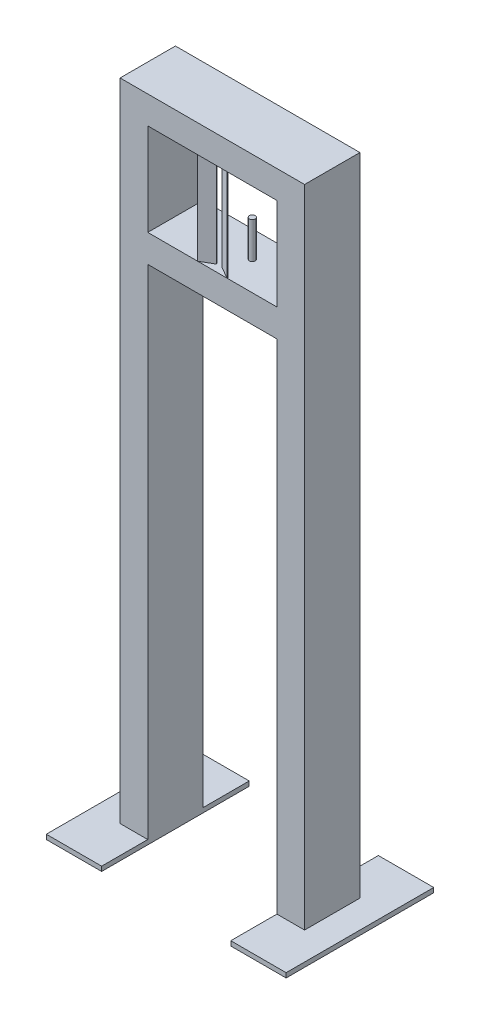
ISO-10303-21;
HEADER;
FILE_DESCRIPTION(('STEP AP214'),'2;1');
FILE_NAME('part.step','',(''),(''),'','','');
FILE_SCHEMA(('AUTOMOTIVE_DESIGN { 1 0 10303 214 1 1 1 1 }'));
ENDSEC;
DATA;
#1=APPLICATION_CONTEXT('core data for automotive mechanical design processes');
#2=APPLICATION_PROTOCOL_DEFINITION('international standard','automotive_design',2000,#1);
#3=PRODUCT_CONTEXT('',#1,'mechanical');
#4=PRODUCT('Part','Part','',(#3));
#5=PRODUCT_RELATED_PRODUCT_CATEGORY('part','',(#4));
#6=PRODUCT_DEFINITION_FORMATION('','',#4);
#7=PRODUCT_DEFINITION_CONTEXT('part definition',#1,'design');
#8=PRODUCT_DEFINITION('design','',#6,#7);
#9=PRODUCT_DEFINITION_SHAPE('','',#8);
#10=(LENGTH_UNIT() NAMED_UNIT(*) SI_UNIT(.MILLI.,.METRE.));
#11=(NAMED_UNIT(*) PLANE_ANGLE_UNIT() SI_UNIT($,.RADIAN.));
#12=(NAMED_UNIT(*) SI_UNIT($,.STERADIAN.) SOLID_ANGLE_UNIT());
#13=UNCERTAINTY_MEASURE_WITH_UNIT(LENGTH_MEASURE(1.E-05),#10,'distance_accuracy_value','');
#14=(GEOMETRIC_REPRESENTATION_CONTEXT(3) GLOBAL_UNCERTAINTY_ASSIGNED_CONTEXT((#13)) GLOBAL_UNIT_ASSIGNED_CONTEXT((#10,
#11,#12)) REPRESENTATION_CONTEXT('',''));
#15=CARTESIAN_POINT('',(0.,0.,0.));
#16=DIRECTION('',(0.,0.,1.));
#17=DIRECTION('',(1.,0.,0.));
#18=AXIS2_PLACEMENT_3D('',#15,#16,#17);
#19=CARTESIAN_POINT('',(-88.8999999999999,857.25,-118.33632750361));
#20=DIRECTION('',(0.,-1.,0.));
#21=DIRECTION('',(0.,0.,-1.));
#22=AXIS2_PLACEMENT_3D('',#19,#20,#21);
#23=PLANE('',#22);
#24=DIRECTION('',(-0.500000000000001,0.,0.866025403784438));
#25=VECTOR('',#24,1.);
#26=CARTESIAN_POINT('',(20.8294826719043,857.250000000022,138.617468245269));
#27=LINE('',#26,#25);
#28=CARTESIAN_POINT('',(20.8294826719043,857.250000000022,138.617468245269));
#29=VERTEX_POINT('',#28);
#30=CARTESIAN_POINT('',(20.2044826719044,857.25,139.7));
#31=VERTEX_POINT('',#30);
#32=EDGE_CURVE('E225',#29,#31,#27,.T.);
#33=ORIENTED_EDGE('',*,*,#32,.F.);
#34=DIRECTION('',(0.866025403784438,0.,0.500000000000002));
#35=VECTOR('',#34,1.);
#36=CARTESIAN_POINT('',(4.375,857.250000000022,129.117468245269));
#37=LINE('',#36,#35);
#38=CARTESIAN_POINT('',(4.375,857.250000000022,129.117468245269));
#39=VERTEX_POINT('',#38);
#40=EDGE_CURVE('E230',#39,#29,#37,.T.);
#41=ORIENTED_EDGE('',*,*,#40,.F.);
#42=DIRECTION('',(0.499999999999997,0.,-0.86602540378444));
#43=VECTOR('',#42,1.);
#44=CARTESIAN_POINT('',(3.75,857.250000000022,130.2));
#45=LINE('',#44,#43);
#46=CARTESIAN_POINT('',(3.75,857.250000000022,130.2));
#47=VERTEX_POINT('',#46);
#48=EDGE_CURVE('E226',#47,#39,#45,.T.);
#49=ORIENTED_EDGE('',*,*,#48,.F.);
#50=DIRECTION('',(-0.866025403784438,0.,-0.500000000000002));
#51=VECTOR('',#50,1.);
#52=CARTESIAN_POINT('',(3.75,857.250000000022,130.2));
#53=LINE('',#52,#51);
#54=EDGE_CURVE('E217',#31,#47,#53,.T.);
#55=ORIENTED_EDGE('',*,*,#54,.F.);
#56=DIRECTION('',(1.,0.,0.));
#57=VECTOR('',#56,1.);
#58=CARTESIAN_POINT('',(-88.8999999999999,857.25,139.7));
#59=LINE('',#58,#57);
#60=CARTESIAN_POINT('',(-20.2044826719043,857.250000000022,139.7));
#61=VERTEX_POINT('',#60);
#62=EDGE_CURVE('E374',#61,#31,#59,.T.);
#63=ORIENTED_EDGE('',*,*,#62,.F.);
#64=DIRECTION('',(-0.866025403784438,0.,0.500000000000002));
#65=VECTOR('',#64,1.);
#66=CARTESIAN_POINT('',(-3.75,857.250000000022,130.2));
#67=LINE('',#66,#65);
#68=CARTESIAN_POINT('',(-3.75,857.250000000022,130.2));
#69=VERTEX_POINT('',#68);
#70=EDGE_CURVE('E264',#69,#61,#67,.T.);
#71=ORIENTED_EDGE('',*,*,#70,.F.);
#72=DIRECTION('',(0.499999999999997,0.,0.86602540378444));
#73=VECTOR('',#72,1.);
#74=CARTESIAN_POINT('',(-3.75,857.250000000022,130.2));
#75=LINE('',#74,#73);
#76=CARTESIAN_POINT('',(-4.375,857.250000000022,129.117468245269));
#77=VERTEX_POINT('',#76);
#78=EDGE_CURVE('E244',#77,#69,#75,.T.);
#79=ORIENTED_EDGE('',*,*,#78,.F.);
#80=DIRECTION('',(0.866025403784438,0.,-0.500000000000002));
#81=VECTOR('',#80,1.);
#82=CARTESIAN_POINT('',(-4.375,857.250000000022,129.117468245269));
#83=LINE('',#82,#81);
#84=CARTESIAN_POINT('',(-20.8294826719043,857.25,138.617468245269));
#85=VERTEX_POINT('',#84);
#86=EDGE_CURVE('E259',#85,#77,#83,.T.);
#87=ORIENTED_EDGE('',*,*,#86,.F.);
#88=DIRECTION('',(-0.500000000000001,0.,-0.866025403784438));
#89=VECTOR('',#88,1.);
#90=CARTESIAN_POINT('',(-20.8294826719043,857.250000000022,138.617468245269));
#91=LINE('',#90,#89);
#92=EDGE_CURVE('E261',#61,#85,#91,.T.);
#93=ORIENTED_EDGE('',*,*,#92,.F.);
#94=CARTESIAN_POINT('',(-88.8999999999999,857.25,139.7));
#95=VERTEX_POINT('',#94);
#96=EDGE_CURVE('E370',#95,#61,#59,.T.);
#97=ORIENTED_EDGE('',*,*,#96,.F.);
#98=DIRECTION('',(0.,0.,1.));
#99=VECTOR('',#98,1.);
#100=CARTESIAN_POINT('',(-88.8999999999999,857.25,-118.33632750361));
#101=LINE('',#100,#99);
#102=CARTESIAN_POINT('',(-88.8999999999999,857.25,63.4999999999999));
#103=VERTEX_POINT('',#102);
#104=EDGE_CURVE('E373',#103,#95,#101,.T.);
#105=ORIENTED_EDGE('',*,*,#104,.F.);
#106=DIRECTION('',(-1.,0.,0.));
#107=VECTOR('',#106,1.);
#108=CARTESIAN_POINT('',(-88.8999999999999,857.25,63.4999999999999));
#109=LINE('',#108,#107);
#110=CARTESIAN_POINT('',(88.8999999999999,857.25,63.4999999999999));
#111=VERTEX_POINT('',#110);
#112=EDGE_CURVE('E378',#111,#103,#109,.T.);
#113=ORIENTED_EDGE('',*,*,#112,.F.);
#114=DIRECTION('',(0.,0.,1.));
#115=VECTOR('',#114,1.);
#116=CARTESIAN_POINT('',(88.8999999999999,857.25,-118.33632750361));
#117=LINE('',#116,#115);
#118=CARTESIAN_POINT('',(88.8999999999999,857.25,139.7));
#119=VERTEX_POINT('',#118);
#120=EDGE_CURVE('E375',#111,#119,#117,.T.);
#121=ORIENTED_EDGE('',*,*,#120,.T.);
#122=EDGE_CURVE('E369',#31,#119,#59,.T.);
#123=ORIENTED_EDGE('',*,*,#122,.F.);
#124=EDGE_LOOP('',(#33,#41,#49,#55,#63,#71,#79,#87,#93,#97,#105,#113,#121,#123));
#125=FACE_BOUND('',#124,.T.);
#126=ADVANCED_FACE('F33',(#125),#23,.T.);
#127=CARTESIAN_POINT('',(88.8999999999999,730.25,-118.33632750361));
#128=DIRECTION('',(0.,1.,0.));
#129=DIRECTION('',(0.,0.,1.));
#130=AXIS2_PLACEMENT_3D('',#127,#128,#129);
#131=PLANE('',#130);
#132=CARTESIAN_POINT('',(15.,730.25,99.6999999999999));
#133=DIRECTION('',(0.,1.,0.));
#134=DIRECTION('',(0.,0.,1.));
#135=AXIS2_PLACEMENT_3D('',#132,#133,#134);
#136=CIRCLE('',#135,4.);
#137=CARTESIAN_POINT('',(15.,730.25,103.7));
#138=VERTEX_POINT('',#137);
#139=EDGE_CURVE('E237',#138,#138,#136,.T.);
#140=ORIENTED_EDGE('',*,*,#139,.F.);
#141=EDGE_LOOP('',(#140));
#142=FACE_BOUND('',#141,.T.);
#143=DIRECTION('',(-0.499999999999997,0.,0.86602540378444));
#144=VECTOR('',#143,1.);
#145=CARTESIAN_POINT('',(3.75,730.25,130.2));
#146=LINE('',#145,#144);
#147=CARTESIAN_POINT('',(4.375,730.25,129.117468245269));
#148=VERTEX_POINT('',#147);
#149=CARTESIAN_POINT('',(3.75,730.25,130.2));
#150=VERTEX_POINT('',#149);
#151=EDGE_CURVE('E48',#148,#150,#146,.T.);
#152=ORIENTED_EDGE('',*,*,#151,.F.);
#153=DIRECTION('',(-0.866025403784438,0.,-0.500000000000002));
#154=VECTOR('',#153,1.);
#155=CARTESIAN_POINT('',(4.375,730.25,129.117468245269));
#156=LINE('',#155,#154);
#157=CARTESIAN_POINT('',(20.8294826719043,730.25,138.617468245269));
#158=VERTEX_POINT('',#157);
#159=EDGE_CURVE('E245',#158,#148,#156,.T.);
#160=ORIENTED_EDGE('',*,*,#159,.F.);
#161=DIRECTION('',(0.500000000000001,0.,-0.866025403784438));
#162=VECTOR('',#161,1.);
#163=CARTESIAN_POINT('',(20.8294826719043,730.25,138.617468245269));
#164=LINE('',#163,#162);
#165=CARTESIAN_POINT('',(20.2044826719043,730.25,139.7));
#166=VERTEX_POINT('',#165);
#167=EDGE_CURVE('E248',#166,#158,#164,.T.);
#168=ORIENTED_EDGE('',*,*,#167,.F.);
#169=DIRECTION('',(-1.,0.,0.));
#170=VECTOR('',#169,1.);
#171=CARTESIAN_POINT('',(88.8999999999999,730.25,139.7));
#172=LINE('',#171,#170);
#173=CARTESIAN_POINT('',(88.8999999999999,730.25,139.7));
#174=VERTEX_POINT('',#173);
#175=EDGE_CURVE('E293',#174,#166,#172,.T.);
#176=ORIENTED_EDGE('',*,*,#175,.F.);
#177=DIRECTION('',(0.,0.,1.));
#178=VECTOR('',#177,1.);
#179=CARTESIAN_POINT('',(88.8999999999999,730.25,-118.33632750361));
#180=LINE('',#179,#178);
#181=CARTESIAN_POINT('',(88.8999999999999,730.25,63.4999999999999));
#182=VERTEX_POINT('',#181);
#183=EDGE_CURVE('E300',#182,#174,#180,.T.);
#184=ORIENTED_EDGE('',*,*,#183,.F.);
#185=DIRECTION('',(1.,0.,0.));
#186=VECTOR('',#185,1.);
#187=CARTESIAN_POINT('',(88.8999999999999,730.25,63.4999999999999));
#188=LINE('',#187,#186);
#189=CARTESIAN_POINT('',(-88.8999999999999,730.25,63.4999999999999));
#190=VERTEX_POINT('',#189);
#191=EDGE_CURVE('E291',#190,#182,#188,.T.);
#192=ORIENTED_EDGE('',*,*,#191,.F.);
#193=DIRECTION('',(0.,0.,1.));
#194=VECTOR('',#193,1.);
#195=CARTESIAN_POINT('',(-88.8999999999999,730.25,-118.33632750361));
#196=LINE('',#195,#194);
#197=CARTESIAN_POINT('',(-88.8999999999999,730.25,139.7));
#198=VERTEX_POINT('',#197);
#199=EDGE_CURVE('E306',#190,#198,#196,.T.);
#200=ORIENTED_EDGE('',*,*,#199,.T.);
#201=CARTESIAN_POINT('',(-20.2044826719043,730.25,139.7));
#202=VERTEX_POINT('',#201);
#203=EDGE_CURVE('E274',#202,#198,#172,.T.);
#204=ORIENTED_EDGE('',*,*,#203,.F.);
#205=DIRECTION('',(0.500000000000001,0.,0.866025403784438));
#206=VECTOR('',#205,1.);
#207=CARTESIAN_POINT('',(-20.8294826719043,730.25,138.617468245269));
#208=LINE('',#207,#206);
#209=CARTESIAN_POINT('',(-20.8294826719043,730.25,138.617468245269));
#210=VERTEX_POINT('',#209);
#211=EDGE_CURVE('E270',#210,#202,#208,.T.);
#212=ORIENTED_EDGE('',*,*,#211,.F.);
#213=DIRECTION('',(-0.866025403784438,0.,0.500000000000002));
#214=VECTOR('',#213,1.);
#215=CARTESIAN_POINT('',(-4.375,730.25,129.117468245269));
#216=LINE('',#215,#214);
#217=CARTESIAN_POINT('',(-4.37499999999999,730.25,129.117468245269));
#218=VERTEX_POINT('',#217);
#219=EDGE_CURVE('E275',#218,#210,#216,.T.);
#220=ORIENTED_EDGE('',*,*,#219,.F.);
#221=DIRECTION('',(-0.499999999999997,0.,-0.86602540378444));
#222=VECTOR('',#221,1.);
#223=CARTESIAN_POINT('',(-3.75,730.25,130.2));
#224=LINE('',#223,#222);
#225=CARTESIAN_POINT('',(-3.75,730.25,130.2));
#226=VERTEX_POINT('',#225);
#227=EDGE_CURVE('E272',#226,#218,#224,.T.);
#228=ORIENTED_EDGE('',*,*,#227,.F.);
#229=DIRECTION('',(0.866025403784438,0.,-0.500000000000002));
#230=VECTOR('',#229,1.);
#231=CARTESIAN_POINT('',(-3.75,730.25,130.2));
#232=LINE('',#231,#230);
#233=EDGE_CURVE('E267',#202,#226,#232,.T.);
#234=ORIENTED_EDGE('',*,*,#233,.F.);
#235=EDGE_CURVE('E297',#166,#202,#172,.T.);
#236=ORIENTED_EDGE('',*,*,#235,.F.);
#237=DIRECTION('',(0.866025403784438,0.,0.500000000000002));
#238=VECTOR('',#237,1.);
#239=CARTESIAN_POINT('',(3.75,730.25,130.2));
#240=LINE('',#239,#238);
#241=EDGE_CURVE('E251',#150,#166,#240,.T.);
#242=ORIENTED_EDGE('',*,*,#241,.F.);
#243=EDGE_LOOP('',(#152,#160,#168,#176,#184,#192,#200,#204,#212,#220,#228,#234,#236,#242));
#244=FACE_BOUND('',#243,.T.);
#245=ADVANCED_FACE('F484',(#142,#244),#131,.T.);
#246=CARTESIAN_POINT('',(-88.9,6.35,0.));
#247=DIRECTION('',(-1.,0.,0.));
#248=DIRECTION('',(0.,0.,1.));
#249=AXIS2_PLACEMENT_3D('',#246,#247,#248);
#250=PLANE('',#249);
#251=DIRECTION('',(0.,-1.,0.));
#252=VECTOR('',#251,1.);
#253=CARTESIAN_POINT('',(-88.8999999999999,895.35,63.4999999999999));
#254=LINE('',#253,#252);
#255=CARTESIAN_POINT('',(-88.8999999999999,692.15,63.4999999999999));
#256=VERTEX_POINT('',#255);
#257=CARTESIAN_POINT('',(-88.9,6.35,63.4999999999999));
#258=VERTEX_POINT('',#257);
#259=EDGE_CURVE('E407',#256,#258,#254,.T.);
#260=ORIENTED_EDGE('',*,*,#259,.F.);
#261=DIRECTION('',(0.,0.,1.));
#262=VECTOR('',#261,1.);
#263=CARTESIAN_POINT('',(-88.8999999999999,692.15,-118.33632750361));
#264=LINE('',#263,#262);
#265=CARTESIAN_POINT('',(-88.8999999999999,692.15,139.7));
#266=VERTEX_POINT('',#265);
#267=EDGE_CURVE('E303',#256,#266,#264,.T.);
#268=ORIENTED_EDGE('',*,*,#267,.T.);
#269=DIRECTION('',(0.,-1.,0.));
#270=VECTOR('',#269,1.);
#271=CARTESIAN_POINT('',(-88.8999999999999,895.35,139.7));
#272=LINE('',#271,#270);
#273=CARTESIAN_POINT('',(-88.9,6.35,139.7));
#274=VERTEX_POINT('',#273);
#275=EDGE_CURVE('E390',#266,#274,#272,.T.);
#276=ORIENTED_EDGE('',*,*,#275,.T.);
#277=DIRECTION('',(0.,0.,-1.));
#278=VECTOR('',#277,1.);
#279=CARTESIAN_POINT('',(-88.9,6.35,0.));
#280=LINE('',#279,#278);
#281=CARTESIAN_POINT('',(-88.8999999999999,6.35,203.2));
#282=VERTEX_POINT('',#281);
#283=EDGE_CURVE('E412',#282,#274,#280,.T.);
#284=ORIENTED_EDGE('',*,*,#283,.F.);
#285=DIRECTION('',(0.,-1.,0.));
#286=VECTOR('',#285,1.);
#287=CARTESIAN_POINT('',(-88.8999999999999,6.35,203.2));
#288=LINE('',#287,#286);
#289=CARTESIAN_POINT('',(-88.8999999999999,0.,203.2));
#290=VERTEX_POINT('',#289);
#291=EDGE_CURVE('E422',#282,#290,#288,.T.);
#292=ORIENTED_EDGE('',*,*,#291,.T.);
#293=DIRECTION('',(0.,0.,-1.));
#294=VECTOR('',#293,1.);
#295=CARTESIAN_POINT('',(-88.9,0.,0.));
#296=LINE('',#295,#294);
#297=CARTESIAN_POINT('',(-88.9,0.,0.));
#298=VERTEX_POINT('',#297);
#299=EDGE_CURVE('E411',#290,#298,#296,.T.);
#300=ORIENTED_EDGE('',*,*,#299,.T.);
#301=DIRECTION('',(0.,-1.,0.));
#302=VECTOR('',#301,1.);
#303=CARTESIAN_POINT('',(-88.9,6.35,0.));
#304=LINE('',#303,#302);
#305=CARTESIAN_POINT('',(-88.9,6.35,0.));
#306=VERTEX_POINT('',#305);
#307=EDGE_CURVE('E11',#306,#298,#304,.T.);
#308=ORIENTED_EDGE('',*,*,#307,.F.);
#309=EDGE_CURVE('E416',#258,#306,#280,.T.);
#310=ORIENTED_EDGE('',*,*,#309,.F.);
#311=EDGE_LOOP('',(#260,#268,#276,#284,#292,#300,#308,#310));
#312=FACE_BOUND('',#311,.T.);
#313=ADVANCED_FACE('F454',(#312),#250,.F.);
#314=CARTESIAN_POINT('',(88.9,6.35,0.));
#315=DIRECTION('',(1.,0.,0.));
#316=DIRECTION('',(0.,0.,-1.));
#317=AXIS2_PLACEMENT_3D('',#314,#315,#316);
#318=PLANE('',#317);
#319=DIRECTION('',(0.,-1.,0.));
#320=VECTOR('',#319,1.);
#321=CARTESIAN_POINT('',(88.8999999999999,895.35,139.7));
#322=LINE('',#321,#320);
#323=CARTESIAN_POINT('',(88.8999999999999,692.15,139.7));
#324=VERTEX_POINT('',#323);
#325=CARTESIAN_POINT('',(88.9,6.35,139.7));
#326=VERTEX_POINT('',#325);
#327=EDGE_CURVE('E316',#324,#326,#322,.T.);
#328=ORIENTED_EDGE('',*,*,#327,.F.);
#329=DIRECTION('',(0.,0.,1.));
#330=VECTOR('',#329,1.);
#331=CARTESIAN_POINT('',(88.9,692.15,-118.33632750361));
#332=LINE('',#331,#330);
#333=CARTESIAN_POINT('',(88.9,692.15,63.4999999999999));
#334=VERTEX_POINT('',#333);
#335=EDGE_CURVE('E292',#334,#324,#332,.T.);
#336=ORIENTED_EDGE('',*,*,#335,.F.);
#337=DIRECTION('',(0.,-1.,0.));
#338=VECTOR('',#337,1.);
#339=CARTESIAN_POINT('',(88.8999999999999,895.35,63.4999999999999));
#340=LINE('',#339,#338);
#341=CARTESIAN_POINT('',(88.9,6.35,63.4999999999999));
#342=VERTEX_POINT('',#341);
#343=EDGE_CURVE('E328',#334,#342,#340,.T.);
#344=ORIENTED_EDGE('',*,*,#343,.T.);
#345=DIRECTION('',(0.,0.,1.));
#346=VECTOR('',#345,1.);
#347=CARTESIAN_POINT('',(88.9,6.35,0.));
#348=LINE('',#347,#346);
#349=CARTESIAN_POINT('',(88.9,6.35,0.));
#350=VERTEX_POINT('',#349);
#351=EDGE_CURVE('E343',#350,#342,#348,.T.);
#352=ORIENTED_EDGE('',*,*,#351,.F.);
#353=DIRECTION('',(0.,-1.,0.));
#354=VECTOR('',#353,1.);
#355=CARTESIAN_POINT('',(88.9,6.35,0.));
#356=LINE('',#355,#354);
#357=CARTESIAN_POINT('',(88.9,0.,0.));
#358=VERTEX_POINT('',#357);
#359=EDGE_CURVE('E366',#350,#358,#356,.T.);
#360=ORIENTED_EDGE('',*,*,#359,.T.);
#361=DIRECTION('',(0.,0.,1.));
#362=VECTOR('',#361,1.);
#363=CARTESIAN_POINT('',(88.9,0.,0.));
#364=LINE('',#363,#362);
#365=CARTESIAN_POINT('',(88.9,0.,203.2));
#366=VERTEX_POINT('',#365);
#367=EDGE_CURVE('E353',#358,#366,#364,.T.);
#368=ORIENTED_EDGE('',*,*,#367,.T.);
#369=DIRECTION('',(0.,-1.,0.));
#370=VECTOR('',#369,1.);
#371=CARTESIAN_POINT('',(88.9,6.35,203.2));
#372=LINE('',#371,#370);
#373=CARTESIAN_POINT('',(88.9,6.35,203.2));
#374=VERTEX_POINT('',#373);
#375=EDGE_CURVE('E363',#374,#366,#372,.T.);
#376=ORIENTED_EDGE('',*,*,#375,.F.);
#377=EDGE_CURVE('E341',#326,#374,#348,.T.);
#378=ORIENTED_EDGE('',*,*,#377,.F.);
#379=EDGE_LOOP('',(#328,#336,#344,#352,#360,#368,#376,#378));
#380=FACE_BOUND('',#379,.T.);
#381=ADVANCED_FACE('F510',(#380),#318,.F.);
#382=CARTESIAN_POINT('',(0.,6.35,0.));
#383=DIRECTION('',(0.,-1.,0.));
#384=DIRECTION('',(0.,0.,-1.));
#385=AXIS2_PLACEMENT_3D('',#382,#383,#384);
#386=PLANE('',#385);
#387=DIRECTION('',(1.,0.,0.));
#388=VECTOR('',#387,1.);
#389=CARTESIAN_POINT('',(-127.,6.35,139.7));
#390=LINE('',#389,#388);
#391=CARTESIAN_POINT('',(-127.,6.35,139.7));
#392=VERTEX_POINT('',#391);
#393=EDGE_CURVE('E386',#392,#274,#390,.T.);
#394=ORIENTED_EDGE('',*,*,#393,.F.);
#395=DIRECTION('',(0.,0.,1.));
#396=VECTOR('',#395,1.);
#397=CARTESIAN_POINT('',(-127.,6.35,139.7));
#398=LINE('',#397,#396);
#399=CARTESIAN_POINT('',(-127.,6.35,63.4999999999999));
#400=VERTEX_POINT('',#399);
#401=EDGE_CURVE('E393',#400,#392,#398,.T.);
#402=ORIENTED_EDGE('',*,*,#401,.F.);
#403=DIRECTION('',(-1.,0.,0.));
#404=VECTOR('',#403,1.);
#405=CARTESIAN_POINT('',(-127.,6.35,63.4999999999999));
#406=LINE('',#405,#404);
#407=EDGE_CURVE('E382',#258,#400,#406,.T.);
#408=ORIENTED_EDGE('',*,*,#407,.F.);
#409=ORIENTED_EDGE('',*,*,#309,.T.);
#410=DIRECTION('',(-1.,0.,0.));
#411=VECTOR('',#410,1.);
#412=CARTESIAN_POINT('',(-88.9,6.35,0.));
#413=LINE('',#412,#411);
#414=CARTESIAN_POINT('',(-165.1,6.35,0.));
#415=VERTEX_POINT('',#414);
#416=EDGE_CURVE('E415',#306,#415,#413,.T.);
#417=ORIENTED_EDGE('',*,*,#416,.T.);
#418=DIRECTION('',(0.,0.,1.));
#419=VECTOR('',#418,1.);
#420=CARTESIAN_POINT('',(-165.1,6.35,0.));
#421=LINE('',#420,#419);
#422=CARTESIAN_POINT('',(-165.1,6.35,203.2));
#423=VERTEX_POINT('',#422);
#424=EDGE_CURVE('E418',#415,#423,#421,.T.);
#425=ORIENTED_EDGE('',*,*,#424,.T.);
#426=DIRECTION('',(1.,0.,0.));
#427=VECTOR('',#426,1.);
#428=CARTESIAN_POINT('',(-88.8999999999999,6.35,203.2));
#429=LINE('',#428,#427);
#430=EDGE_CURVE('E420',#423,#282,#429,.T.);
#431=ORIENTED_EDGE('',*,*,#430,.T.);
#432=ORIENTED_EDGE('',*,*,#283,.T.);
#433=EDGE_LOOP('',(#394,#402,#408,#409,#417,#425,#431,#432));
#434=FACE_BOUND('',#433,.T.);
#435=ADVANCED_FACE('F457',(#434),#386,.F.);
#436=EDGE_CURVE('E398',#95,#198,#272,.T.);
#437=ORIENTED_EDGE('',*,*,#436,.T.);
#438=ORIENTED_EDGE('',*,*,#199,.F.);
#439=EDGE_CURVE('E408',#103,#190,#254,.T.);
#440=ORIENTED_EDGE('',*,*,#439,.F.);
#441=ORIENTED_EDGE('',*,*,#104,.T.);
#442=EDGE_LOOP('',(#437,#438,#440,#441));
#443=FACE_BOUND('',#442,.T.);
#444=ADVANCED_FACE('F35',(#443),#250,.F.);
#445=CARTESIAN_POINT('',(-88.9,6.35,0.));
#446=DIRECTION('',(0.,0.,1.));
#447=DIRECTION('',(1.,0.,0.));
#448=AXIS2_PLACEMENT_3D('',#445,#446,#447);
#449=PLANE('',#448);
#450=DIRECTION('',(-1.,0.,0.));
#451=VECTOR('',#450,1.);
#452=CARTESIAN_POINT('',(-88.9,0.,0.));
#453=LINE('',#452,#451);
#454=CARTESIAN_POINT('',(-165.1,0.,0.));
#455=VERTEX_POINT('',#454);
#456=EDGE_CURVE('E425',#298,#455,#453,.T.);
#457=ORIENTED_EDGE('',*,*,#456,.T.);
#458=DIRECTION('',(0.,-1.,0.));
#459=VECTOR('',#458,1.);
#460=CARTESIAN_POINT('',(-165.1,6.35,0.));
#461=LINE('',#460,#459);
#462=EDGE_CURVE('E41',#415,#455,#461,.T.);
#463=ORIENTED_EDGE('',*,*,#462,.F.);
#464=ORIENTED_EDGE('',*,*,#416,.F.);
#465=ORIENTED_EDGE('',*,*,#307,.T.);
#466=EDGE_LOOP('',(#457,#463,#464,#465));
#467=FACE_BOUND('',#466,.T.);
#468=ADVANCED_FACE('F475',(#467),#449,.F.);
#469=CARTESIAN_POINT('',(-165.1,6.35,0.));
#470=DIRECTION('',(1.,0.,0.));
#471=DIRECTION('',(0.,0.,-1.));
#472=AXIS2_PLACEMENT_3D('',#469,#470,#471);
#473=PLANE('',#472);
#474=DIRECTION('',(0.,0.,1.));
#475=VECTOR('',#474,1.);
#476=CARTESIAN_POINT('',(-165.1,0.,0.));
#477=LINE('',#476,#475);
#478=CARTESIAN_POINT('',(-165.1,0.,203.2));
#479=VERTEX_POINT('',#478);
#480=EDGE_CURVE('E427',#455,#479,#477,.T.);
#481=ORIENTED_EDGE('',*,*,#480,.T.);
#482=DIRECTION('',(0.,-1.,0.));
#483=VECTOR('',#482,1.);
#484=CARTESIAN_POINT('',(-165.1,6.35,203.2));
#485=LINE('',#484,#483);
#486=EDGE_CURVE('E433',#423,#479,#485,.T.);
#487=ORIENTED_EDGE('',*,*,#486,.F.);
#488=ORIENTED_EDGE('',*,*,#424,.F.);
#489=ORIENTED_EDGE('',*,*,#462,.T.);
#490=EDGE_LOOP('',(#481,#487,#488,#489));
#491=FACE_BOUND('',#490,.T.);
#492=ADVANCED_FACE('F440',(#491),#473,.F.);
#493=CARTESIAN_POINT('',(-88.8999999999999,6.35,203.2));
#494=DIRECTION('',(0.,0.,-1.));
#495=DIRECTION('',(-1.,0.,0.));
#496=AXIS2_PLACEMENT_3D('',#493,#494,#495);
#497=PLANE('',#496);
#498=DIRECTION('',(1.,0.,0.));
#499=VECTOR('',#498,1.);
#500=CARTESIAN_POINT('',(-88.8999999999999,0.,203.2));
#501=LINE('',#500,#499);
#502=EDGE_CURVE('E429',#479,#290,#501,.T.);
#503=ORIENTED_EDGE('',*,*,#502,.T.);
#504=ORIENTED_EDGE('',*,*,#291,.F.);
#505=ORIENTED_EDGE('',*,*,#430,.F.);
#506=ORIENTED_EDGE('',*,*,#486,.T.);
#507=EDGE_LOOP('',(#503,#504,#505,#506));
#508=FACE_BOUND('',#507,.T.);
#509=ADVANCED_FACE('F450',(#508),#497,.F.);
#510=CARTESIAN_POINT('',(0.,0.,0.));
#511=DIRECTION('',(0.,-1.,0.));
#512=DIRECTION('',(0.,0.,-1.));
#513=AXIS2_PLACEMENT_3D('',#510,#511,#512);
#514=PLANE('',#513);
#515=ORIENTED_EDGE('',*,*,#299,.F.);
#516=ORIENTED_EDGE('',*,*,#502,.F.);
#517=ORIENTED_EDGE('',*,*,#480,.F.);
#518=ORIENTED_EDGE('',*,*,#456,.F.);
#519=EDGE_LOOP('',(#515,#516,#517,#518));
#520=FACE_BOUND('',#519,.T.);
#521=ADVANCED_FACE('F447',(#520),#514,.T.);
#522=CARTESIAN_POINT('',(-127.,895.35,63.4999999999999));
#523=DIRECTION('',(0.,0.,1.));
#524=DIRECTION('',(1.,0.,0.));
#525=AXIS2_PLACEMENT_3D('',#522,#523,#524);
#526=PLANE('',#525);
#527=ORIENTED_EDGE('',*,*,#439,.T.);
#528=ORIENTED_EDGE('',*,*,#191,.T.);
#529=EDGE_CURVE('E329',#111,#182,#340,.T.);
#530=ORIENTED_EDGE('',*,*,#529,.F.);
#531=ORIENTED_EDGE('',*,*,#112,.T.);
#532=EDGE_LOOP('',(#527,#528,#530,#531));
#533=FACE_BOUND('',#532,.T.);
#534=ORIENTED_EDGE('',*,*,#407,.T.);
#535=DIRECTION('',(0.,-1.,0.));
#536=VECTOR('',#535,1.);
#537=CARTESIAN_POINT('',(-127.,895.35,63.4999999999999));
#538=LINE('',#537,#536);
#539=CARTESIAN_POINT('',(-127.,895.35,63.4999999999999));
#540=VERTEX_POINT('',#539);
#541=EDGE_CURVE('E404',#540,#400,#538,.T.);
#542=ORIENTED_EDGE('',*,*,#541,.F.);
#543=DIRECTION('',(-1.,0.,0.));
#544=VECTOR('',#543,1.);
#545=CARTESIAN_POINT('',(-127.,895.35,63.4999999999999));
#546=LINE('',#545,#544);
#547=CARTESIAN_POINT('',(127.,895.35,63.4999999999999));
#548=VERTEX_POINT('',#547);
#549=EDGE_CURVE('E383',#548,#540,#546,.T.);
#550=ORIENTED_EDGE('',*,*,#549,.F.);
#551=DIRECTION('',(0.,-1.,0.));
#552=VECTOR('',#551,1.);
#553=CARTESIAN_POINT('',(127.,895.35,63.4999999999999));
#554=LINE('',#553,#552);
#555=CARTESIAN_POINT('',(127.,6.35,63.4999999999999));
#556=VERTEX_POINT('',#555);
#557=EDGE_CURVE('E331',#548,#556,#554,.T.);
#558=ORIENTED_EDGE('',*,*,#557,.T.);
#559=DIRECTION('',(-1.,0.,0.));
#560=VECTOR('',#559,1.);
#561=CARTESIAN_POINT('',(127.,6.35,63.4999999999999));
#562=LINE('',#561,#560);
#563=EDGE_CURVE('E317',#556,#342,#562,.T.);
#564=ORIENTED_EDGE('',*,*,#563,.T.);
#565=ORIENTED_EDGE('',*,*,#343,.F.);
#566=DIRECTION('',(-1.,0.,0.));
#567=VECTOR('',#566,1.);
#568=CARTESIAN_POINT('',(88.9,692.15,63.4999999999999));
#569=LINE('',#568,#567);
#570=EDGE_CURVE('E288',#334,#256,#569,.T.);
#571=ORIENTED_EDGE('',*,*,#570,.T.);
#572=ORIENTED_EDGE('',*,*,#259,.T.);
#573=EDGE_LOOP('',(#534,#542,#550,#558,#564,#565,#571,#572));
#574=FACE_BOUND('',#573,.T.);
#575=ADVANCED_FACE('F471',(#533,#574),#526,.F.);
#576=CARTESIAN_POINT('',(-127.,895.35,139.7));
#577=DIRECTION('',(1.,0.,0.));
#578=DIRECTION('',(0.,0.,-1.));
#579=AXIS2_PLACEMENT_3D('',#576,#577,#578);
#580=PLANE('',#579);
#581=ORIENTED_EDGE('',*,*,#401,.T.);
#582=DIRECTION('',(0.,-1.,0.));
#583=VECTOR('',#582,1.);
#584=CARTESIAN_POINT('',(-127.,895.35,139.7));
#585=LINE('',#584,#583);
#586=CARTESIAN_POINT('',(-127.,895.35,139.7));
#587=VERTEX_POINT('',#586);
#588=EDGE_CURVE('E401',#587,#392,#585,.T.);
#589=ORIENTED_EDGE('',*,*,#588,.F.);
#590=DIRECTION('',(0.,0.,1.));
#591=VECTOR('',#590,1.);
#592=CARTESIAN_POINT('',(-127.,895.35,139.7));
#593=LINE('',#592,#591);
#594=EDGE_CURVE('E385',#540,#587,#593,.T.);
#595=ORIENTED_EDGE('',*,*,#594,.F.);
#596=ORIENTED_EDGE('',*,*,#541,.T.);
#597=EDGE_LOOP('',(#581,#589,#595,#596));
#598=FACE_BOUND('',#597,.T.);
#599=ADVANCED_FACE('F466',(#598),#580,.F.);
#600=CARTESIAN_POINT('',(-127.,895.35,139.7));
#601=DIRECTION('',(0.,0.,-1.));
#602=DIRECTION('',(-1.,0.,0.));
#603=AXIS2_PLACEMENT_3D('',#600,#601,#602);
#604=PLANE('',#603);
#605=ORIENTED_EDGE('',*,*,#275,.F.);
#606=DIRECTION('',(1.,0.,0.));
#607=VECTOR('',#606,1.);
#608=CARTESIAN_POINT('',(88.9,692.15,139.7));
#609=LINE('',#608,#607);
#610=EDGE_CURVE('E296',#266,#324,#609,.T.);
#611=ORIENTED_EDGE('',*,*,#610,.T.);
#612=ORIENTED_EDGE('',*,*,#327,.T.);
#613=DIRECTION('',(1.,0.,0.));
#614=VECTOR('',#613,1.);
#615=CARTESIAN_POINT('',(127.,6.35,139.7));
#616=LINE('',#615,#614);
#617=CARTESIAN_POINT('',(127.,6.35,139.7));
#618=VERTEX_POINT('',#617);
#619=EDGE_CURVE('E312',#326,#618,#616,.T.);
#620=ORIENTED_EDGE('',*,*,#619,.T.);
#621=DIRECTION('',(0.,-1.,0.));
#622=VECTOR('',#621,1.);
#623=CARTESIAN_POINT('',(127.,895.35,139.7));
#624=LINE('',#623,#622);
#625=CARTESIAN_POINT('',(127.,895.35,139.7));
#626=VERTEX_POINT('',#625);
#627=EDGE_CURVE('E334',#626,#618,#624,.T.);
#628=ORIENTED_EDGE('',*,*,#627,.F.);
#629=DIRECTION('',(1.,0.,0.));
#630=VECTOR('',#629,1.);
#631=CARTESIAN_POINT('',(-127.,895.35,139.7));
#632=LINE('',#631,#630);
#633=EDGE_CURVE('E388',#587,#626,#632,.T.);
#634=ORIENTED_EDGE('',*,*,#633,.F.);
#635=ORIENTED_EDGE('',*,*,#588,.T.);
#636=ORIENTED_EDGE('',*,*,#393,.T.);
#637=EDGE_LOOP('',(#605,#611,#612,#620,#628,#634,#635,#636));
#638=FACE_BOUND('',#637,.T.);
#639=ORIENTED_EDGE('',*,*,#175,.T.);
#640=ORIENTED_EDGE('',*,*,#235,.T.);
#641=ORIENTED_EDGE('',*,*,#203,.T.);
#642=ORIENTED_EDGE('',*,*,#436,.F.);
#643=ORIENTED_EDGE('',*,*,#96,.T.);
#644=ORIENTED_EDGE('',*,*,#62,.T.);
#645=ORIENTED_EDGE('',*,*,#122,.T.);
#646=EDGE_CURVE('E325',#119,#174,#322,.T.);
#647=ORIENTED_EDGE('',*,*,#646,.T.);
#648=EDGE_LOOP('',(#639,#640,#641,#642,#643,#644,#645,#647));
#649=FACE_BOUND('',#648,.T.);
#650=ADVANCED_FACE('F459',(#638,#649),#604,.F.);
#651=CARTESIAN_POINT('',(0.,895.35,0.));
#652=DIRECTION('',(0.,-1.,0.));
#653=DIRECTION('',(0.,0.,-1.));
#654=AXIS2_PLACEMENT_3D('',#651,#652,#653);
#655=PLANE('',#654);
#656=ORIENTED_EDGE('',*,*,#633,.T.);
#657=DIRECTION('',(0.,0.,-1.));
#658=VECTOR('',#657,1.);
#659=CARTESIAN_POINT('',(127.,895.35,139.7));
#660=LINE('',#659,#658);
#661=EDGE_CURVE('E313',#626,#548,#660,.T.);
#662=ORIENTED_EDGE('',*,*,#661,.T.);
#663=ORIENTED_EDGE('',*,*,#549,.T.);
#664=ORIENTED_EDGE('',*,*,#594,.T.);
#665=EDGE_LOOP('',(#656,#662,#663,#664));
#666=FACE_BOUND('',#665,.T.);
#667=ADVANCED_FACE('F496',(#666),#655,.F.);
#668=CARTESIAN_POINT('',(0.,6.35,0.));
#669=DIRECTION('',(0.,-1.,0.));
#670=DIRECTION('',(0.,0.,-1.));
#671=AXIS2_PLACEMENT_3D('',#668,#669,#670);
#672=PLANE('',#671);
#673=ORIENTED_EDGE('',*,*,#619,.F.);
#674=ORIENTED_EDGE('',*,*,#377,.T.);
#675=DIRECTION('',(1.,0.,0.));
#676=VECTOR('',#675,1.);
#677=CARTESIAN_POINT('',(88.9,6.35,203.2));
#678=LINE('',#677,#676);
#679=CARTESIAN_POINT('',(165.1,6.35,203.2));
#680=VERTEX_POINT('',#679);
#681=EDGE_CURVE('E346',#374,#680,#678,.T.);
#682=ORIENTED_EDGE('',*,*,#681,.T.);
#683=DIRECTION('',(0.,0.,-1.));
#684=VECTOR('',#683,1.);
#685=CARTESIAN_POINT('',(165.1,6.35,0.));
#686=LINE('',#685,#684);
#687=CARTESIAN_POINT('',(165.1,6.35,0.));
#688=VERTEX_POINT('',#687);
#689=EDGE_CURVE('E348',#680,#688,#686,.T.);
#690=ORIENTED_EDGE('',*,*,#689,.T.);
#691=DIRECTION('',(-1.,0.,0.));
#692=VECTOR('',#691,1.);
#693=CARTESIAN_POINT('',(88.9,6.35,0.));
#694=LINE('',#693,#692);
#695=EDGE_CURVE('E338',#688,#350,#694,.T.);
#696=ORIENTED_EDGE('',*,*,#695,.T.);
#697=ORIENTED_EDGE('',*,*,#351,.T.);
#698=ORIENTED_EDGE('',*,*,#563,.F.);
#699=DIRECTION('',(0.,0.,-1.));
#700=VECTOR('',#699,1.);
#701=CARTESIAN_POINT('',(127.,6.35,139.7));
#702=LINE('',#701,#700);
#703=EDGE_CURVE('E320',#618,#556,#702,.T.);
#704=ORIENTED_EDGE('',*,*,#703,.F.);
#705=EDGE_LOOP('',(#673,#674,#682,#690,#696,#697,#698,#704));
#706=FACE_BOUND('',#705,.T.);
#707=ADVANCED_FACE('F499',(#706),#672,.F.);
#708=CARTESIAN_POINT('',(88.9,6.35,0.));
#709=DIRECTION('',(0.,0.,1.));
#710=DIRECTION('',(1.,0.,0.));
#711=AXIS2_PLACEMENT_3D('',#708,#709,#710);
#712=PLANE('',#711);
#713=DIRECTION('',(-1.,0.,0.));
#714=VECTOR('',#713,1.);
#715=CARTESIAN_POINT('',(88.9,0.,0.));
#716=LINE('',#715,#714);
#717=CARTESIAN_POINT('',(165.1,0.,0.));
#718=VERTEX_POINT('',#717);
#719=EDGE_CURVE('E337',#718,#358,#716,.T.);
#720=ORIENTED_EDGE('',*,*,#719,.T.);
#721=ORIENTED_EDGE('',*,*,#359,.F.);
#722=ORIENTED_EDGE('',*,*,#695,.F.);
#723=DIRECTION('',(0.,-1.,0.));
#724=VECTOR('',#723,1.);
#725=CARTESIAN_POINT('',(165.1,6.35,0.));
#726=LINE('',#725,#724);
#727=EDGE_CURVE('E350',#688,#718,#726,.T.);
#728=ORIENTED_EDGE('',*,*,#727,.T.);
#729=EDGE_LOOP('',(#720,#721,#722,#728));
#730=FACE_BOUND('',#729,.T.);
#731=ADVANCED_FACE('F494',(#730),#712,.F.);
#732=ORIENTED_EDGE('',*,*,#529,.T.);
#733=ORIENTED_EDGE('',*,*,#183,.T.);
#734=ORIENTED_EDGE('',*,*,#646,.F.);
#735=ORIENTED_EDGE('',*,*,#120,.F.);
#736=EDGE_LOOP('',(#732,#733,#734,#735));
#737=FACE_BOUND('',#736,.T.);
#738=ADVANCED_FACE('F555',(#737),#318,.F.);
#739=CARTESIAN_POINT('',(88.9,6.35,203.2));
#740=DIRECTION('',(0.,0.,-1.));
#741=DIRECTION('',(-1.,0.,0.));
#742=AXIS2_PLACEMENT_3D('',#739,#740,#741);
#743=PLANE('',#742);
#744=DIRECTION('',(1.,0.,0.));
#745=VECTOR('',#744,1.);
#746=CARTESIAN_POINT('',(88.9,0.,203.2));
#747=LINE('',#746,#745);
#748=CARTESIAN_POINT('',(165.1,0.,203.2));
#749=VERTEX_POINT('',#748);
#750=EDGE_CURVE('E355',#366,#749,#747,.T.);
#751=ORIENTED_EDGE('',*,*,#750,.T.);
#752=DIRECTION('',(0.,-1.,0.));
#753=VECTOR('',#752,1.);
#754=CARTESIAN_POINT('',(165.1,6.35,203.2));
#755=LINE('',#754,#753);
#756=EDGE_CURVE('E360',#680,#749,#755,.T.);
#757=ORIENTED_EDGE('',*,*,#756,.F.);
#758=ORIENTED_EDGE('',*,*,#681,.F.);
#759=ORIENTED_EDGE('',*,*,#375,.T.);
#760=EDGE_LOOP('',(#751,#757,#758,#759));
#761=FACE_BOUND('',#760,.T.);
#762=ADVANCED_FACE('F562',(#761),#743,.F.);
#763=CARTESIAN_POINT('',(165.1,6.35,0.));
#764=DIRECTION('',(-1.,0.,0.));
#765=DIRECTION('',(0.,0.,1.));
#766=AXIS2_PLACEMENT_3D('',#763,#764,#765);
#767=PLANE('',#766);
#768=DIRECTION('',(0.,0.,-1.));
#769=VECTOR('',#768,1.);
#770=CARTESIAN_POINT('',(165.1,0.,0.));
#771=LINE('',#770,#769);
#772=EDGE_CURVE('E342',#749,#718,#771,.T.);
#773=ORIENTED_EDGE('',*,*,#772,.T.);
#774=ORIENTED_EDGE('',*,*,#727,.F.);
#775=ORIENTED_EDGE('',*,*,#689,.F.);
#776=ORIENTED_EDGE('',*,*,#756,.T.);
#777=EDGE_LOOP('',(#773,#774,#775,#776));
#778=FACE_BOUND('',#777,.T.);
#779=ADVANCED_FACE('F569',(#778),#767,.F.);
#780=CARTESIAN_POINT('',(0.,0.,0.));
#781=DIRECTION('',(0.,-1.,0.));
#782=DIRECTION('',(0.,0.,-1.));
#783=AXIS2_PLACEMENT_3D('',#780,#781,#782);
#784=PLANE('',#783);
#785=ORIENTED_EDGE('',*,*,#719,.F.);
#786=ORIENTED_EDGE('',*,*,#772,.F.);
#787=ORIENTED_EDGE('',*,*,#750,.F.);
#788=ORIENTED_EDGE('',*,*,#367,.F.);
#789=EDGE_LOOP('',(#785,#786,#787,#788));
#790=FACE_BOUND('',#789,.T.);
#791=ADVANCED_FACE('F577',(#790),#784,.T.);
#792=CARTESIAN_POINT('',(127.,895.35,139.7));
#793=DIRECTION('',(-1.,0.,0.));
#794=DIRECTION('',(0.,0.,1.));
#795=AXIS2_PLACEMENT_3D('',#792,#793,#794);
#796=PLANE('',#795);
#797=ORIENTED_EDGE('',*,*,#703,.T.);
#798=ORIENTED_EDGE('',*,*,#557,.F.);
#799=ORIENTED_EDGE('',*,*,#661,.F.);
#800=ORIENTED_EDGE('',*,*,#627,.T.);
#801=EDGE_LOOP('',(#797,#798,#799,#800));
#802=FACE_BOUND('',#801,.T.);
#803=ADVANCED_FACE('F585',(#802),#796,.F.);
#804=CARTESIAN_POINT('',(88.9,692.15,-118.33632750361));
#805=DIRECTION('',(0.,-1.,0.));
#806=DIRECTION('',(0.,0.,-1.));
#807=AXIS2_PLACEMENT_3D('',#804,#805,#806);
#808=PLANE('',#807);
#809=ORIENTED_EDGE('',*,*,#570,.F.);
#810=ORIENTED_EDGE('',*,*,#335,.T.);
#811=ORIENTED_EDGE('',*,*,#610,.F.);
#812=ORIENTED_EDGE('',*,*,#267,.F.);
#813=EDGE_LOOP('',(#809,#810,#811,#812));
#814=FACE_BOUND('',#813,.T.);
#815=ADVANCED_FACE('F593',(#814),#808,.T.);
#816=CARTESIAN_POINT('',(-3.75,500000.,130.2));
#817=DIRECTION('',(-0.500000000000002,0.,-0.866025403784438));
#818=DIRECTION('',(-0.866025403784438,0.,0.500000000000002));
#819=AXIS2_PLACEMENT_3D('',#816,#817,#818);
#820=PLANE('',#819);
#821=DIRECTION('',(0.,-1.,0.));
#822=VECTOR('',#821,1.);
#823=CARTESIAN_POINT('',(-3.75,500000.,130.2));
#824=LINE('',#823,#822);
#825=EDGE_CURVE('E271',#69,#226,#824,.T.);
#826=ORIENTED_EDGE('',*,*,#825,.F.);
#827=ORIENTED_EDGE('',*,*,#70,.T.);
#828=DIRECTION('',(0.,-1.,0.));
#829=VECTOR('',#828,1.);
#830=CARTESIAN_POINT('',(-20.2044826719043,500000.,139.7));
#831=LINE('',#830,#829);
#832=EDGE_CURVE('E284',#61,#202,#831,.T.);
#833=ORIENTED_EDGE('',*,*,#832,.T.);
#834=ORIENTED_EDGE('',*,*,#233,.T.);
#835=EDGE_LOOP('',(#826,#827,#833,#834));
#836=FACE_BOUND('',#835,.T.);
#837=ADVANCED_FACE('F601',(#836),#820,.F.);
#838=CARTESIAN_POINT('',(-3.75,500000.,130.2));
#839=DIRECTION('',(-0.86602540378444,0.,0.499999999999997));
#840=DIRECTION('',(0.499999999999997,0.,0.86602540378444));
#841=AXIS2_PLACEMENT_3D('',#838,#839,#840);
#842=PLANE('',#841);
#843=DIRECTION('',(0.,-1.,0.));
#844=VECTOR('',#843,1.);
#845=CARTESIAN_POINT('',(-4.375,500000.,129.117468245269));
#846=LINE('',#845,#844);
#847=EDGE_CURVE('E266',#77,#218,#846,.T.);
#848=ORIENTED_EDGE('',*,*,#847,.F.);
#849=ORIENTED_EDGE('',*,*,#78,.T.);
#850=ORIENTED_EDGE('',*,*,#825,.T.);
#851=ORIENTED_EDGE('',*,*,#227,.T.);
#852=EDGE_LOOP('',(#848,#849,#850,#851));
#853=FACE_BOUND('',#852,.T.);
#854=ADVANCED_FACE('F609',(#853),#842,.F.);
#855=CARTESIAN_POINT('',(-20.8294826719043,500000.,138.617468245269));
#856=DIRECTION('',(0.866025403784438,0.,-0.500000000000001));
#857=DIRECTION('',(-0.500000000000001,0.,-0.866025403784438));
#858=AXIS2_PLACEMENT_3D('',#855,#856,#857);
#859=PLANE('',#858);
#860=ORIENTED_EDGE('',*,*,#832,.F.);
#861=ORIENTED_EDGE('',*,*,#92,.T.);
#862=DIRECTION('',(0.,-1.,0.));
#863=VECTOR('',#862,1.);
#864=CARTESIAN_POINT('',(-20.8294826719043,500000.,138.617468245269));
#865=LINE('',#864,#863);
#866=EDGE_CURVE('E282',#85,#210,#865,.T.);
#867=ORIENTED_EDGE('',*,*,#866,.T.);
#868=ORIENTED_EDGE('',*,*,#211,.T.);
#869=EDGE_LOOP('',(#860,#861,#867,#868));
#870=FACE_BOUND('',#869,.T.);
#871=ADVANCED_FACE('F617',(#870),#859,.F.);
#872=CARTESIAN_POINT('',(-4.375,500000.,129.117468245269));
#873=DIRECTION('',(0.500000000000002,0.,0.866025403784438));
#874=DIRECTION('',(0.866025403784438,0.,-0.500000000000002));
#875=AXIS2_PLACEMENT_3D('',#872,#873,#874);
#876=PLANE('',#875);
#877=ORIENTED_EDGE('',*,*,#866,.F.);
#878=ORIENTED_EDGE('',*,*,#86,.T.);
#879=ORIENTED_EDGE('',*,*,#847,.T.);
#880=ORIENTED_EDGE('',*,*,#219,.T.);
#881=EDGE_LOOP('',(#877,#878,#879,#880));
#882=FACE_BOUND('',#881,.T.);
#883=ADVANCED_FACE('F604',(#882),#876,.F.);
#884=CARTESIAN_POINT('',(4.375,500000.,129.117468245269));
#885=DIRECTION('',(-0.500000000000002,0.,0.866025403784438));
#886=DIRECTION('',(0.866025403784438,0.,0.500000000000002));
#887=AXIS2_PLACEMENT_3D('',#884,#885,#886);
#888=PLANE('',#887);
#889=DIRECTION('',(0.,-1.,0.));
#890=VECTOR('',#889,1.);
#891=CARTESIAN_POINT('',(4.375,500000.,129.117468245269));
#892=LINE('',#891,#890);
#893=EDGE_CURVE('E252',#39,#148,#892,.T.);
#894=ORIENTED_EDGE('',*,*,#893,.F.);
#895=ORIENTED_EDGE('',*,*,#40,.T.);
#896=DIRECTION('',(0.,-1.,0.));
#897=VECTOR('',#896,1.);
#898=CARTESIAN_POINT('',(20.8294826719043,500000.,138.617468245269));
#899=LINE('',#898,#897);
#900=EDGE_CURVE('E255',#29,#158,#899,.T.);
#901=ORIENTED_EDGE('',*,*,#900,.T.);
#902=ORIENTED_EDGE('',*,*,#159,.T.);
#903=EDGE_LOOP('',(#894,#895,#901,#902));
#904=FACE_BOUND('',#903,.T.);
#905=ADVANCED_FACE('F632',(#904),#888,.F.);
#906=CARTESIAN_POINT('',(3.75,500000.,130.2));
#907=DIRECTION('',(0.86602540378444,0.,0.499999999999997));
#908=DIRECTION('',(0.499999999999997,0.,-0.86602540378444));
#909=AXIS2_PLACEMENT_3D('',#906,#907,#908);
#910=PLANE('',#909);
#911=DIRECTION('',(0.,-1.,0.));
#912=VECTOR('',#911,1.);
#913=CARTESIAN_POINT('',(3.75,500000.,130.2));
#914=LINE('',#913,#912);
#915=EDGE_CURVE('E219',#47,#150,#914,.T.);
#916=ORIENTED_EDGE('',*,*,#915,.F.);
#917=ORIENTED_EDGE('',*,*,#48,.T.);
#918=ORIENTED_EDGE('',*,*,#893,.T.);
#919=ORIENTED_EDGE('',*,*,#151,.T.);
#920=EDGE_LOOP('',(#916,#917,#918,#919));
#921=FACE_BOUND('',#920,.T.);
#922=ADVANCED_FACE('F228',(#921),#910,.F.);
#923=CARTESIAN_POINT('',(20.8294826719043,500000.,138.617468245269));
#924=DIRECTION('',(-0.866025403784438,0.,-0.500000000000001));
#925=DIRECTION('',(-0.500000000000001,0.,0.866025403784438));
#926=AXIS2_PLACEMENT_3D('',#923,#924,#925);
#927=PLANE('',#926);
#928=ORIENTED_EDGE('',*,*,#900,.F.);
#929=ORIENTED_EDGE('',*,*,#32,.T.);
#930=DIRECTION('',(0.,-1.,0.));
#931=VECTOR('',#930,1.);
#932=CARTESIAN_POINT('',(20.2044826719043,500000.,139.7));
#933=LINE('',#932,#931);
#934=EDGE_CURVE('E56',#31,#166,#933,.T.);
#935=ORIENTED_EDGE('',*,*,#934,.T.);
#936=ORIENTED_EDGE('',*,*,#167,.T.);
#937=EDGE_LOOP('',(#928,#929,#935,#936));
#938=FACE_BOUND('',#937,.T.);
#939=ADVANCED_FACE('F648',(#938),#927,.F.);
#940=CARTESIAN_POINT('',(3.75,500000.,130.2));
#941=DIRECTION('',(0.500000000000002,0.,-0.866025403784438));
#942=DIRECTION('',(-0.866025403784438,0.,-0.500000000000002));
#943=AXIS2_PLACEMENT_3D('',#940,#941,#942);
#944=PLANE('',#943);
#945=ORIENTED_EDGE('',*,*,#934,.F.);
#946=ORIENTED_EDGE('',*,*,#54,.T.);
#947=ORIENTED_EDGE('',*,*,#915,.T.);
#948=ORIENTED_EDGE('',*,*,#241,.T.);
#949=EDGE_LOOP('',(#945,#946,#947,#948));
#950=FACE_BOUND('',#949,.T.);
#951=ADVANCED_FACE('F218',(#950),#944,.F.);
#952=CARTESIAN_POINT('',(15.,780.25,99.6999999999999));
#953=DIRECTION('',(0.,-1.,0.));
#954=DIRECTION('',(0.,0.,-1.));
#955=AXIS2_PLACEMENT_3D('',#952,#953,#954);
#956=CYLINDRICAL_SURFACE('',#955,4.);
#957=CARTESIAN_POINT('',(15.,780.25,99.6999999999999));
#958=DIRECTION('',(0.,1.,0.));
#959=DIRECTION('',(0.,0.,1.));
#960=AXIS2_PLACEMENT_3D('',#957,#958,#959);
#961=CIRCLE('',#960,4.);
#962=CARTESIAN_POINT('',(15.,780.25,103.7));
#963=VERTEX_POINT('',#962);
#964=EDGE_CURVE('E234',#963,#963,#961,.T.);
#965=ORIENTED_EDGE('',*,*,#964,.F.);
#966=EDGE_LOOP('',(#965));
#967=FACE_BOUND('',#966,.T.);
#968=ORIENTED_EDGE('',*,*,#139,.T.);
#969=EDGE_LOOP('',(#968));
#970=FACE_BOUND('',#969,.T.);
#971=ADVANCED_FACE('F642',(#967,#970),#956,.T.);
#972=CARTESIAN_POINT('',(15.,780.25,99.6999999999999));
#973=DIRECTION('',(0.,1.,0.));
#974=DIRECTION('',(0.,0.,1.));
#975=AXIS2_PLACEMENT_3D('',#972,#973,#974);
#976=PLANE('',#975);
#977=ORIENTED_EDGE('',*,*,#964,.T.);
#978=EDGE_LOOP('',(#977));
#979=FACE_BOUND('',#978,.T.);
#980=ADVANCED_FACE('F668',(#979),#976,.T.);
#981=CLOSED_SHELL('',(#126,#245,#313,#381,#435,#444,#468,#492,#509,#521,#575,#599,#650,#667,
#707,#731,#738,#762,#779,#791,#803,#815,#837,#854,#871,#883,#905,#922,#939,#951,#971,#980));
#982=MANIFOLD_SOLID_BREP('B2',#981);
#983=ADVANCED_BREP_SHAPE_REPRESENTATION('',(#18,#982),#14);
#984=SHAPE_DEFINITION_REPRESENTATION(#9,#983);
ENDSEC;
END-ISO-10303-21;
